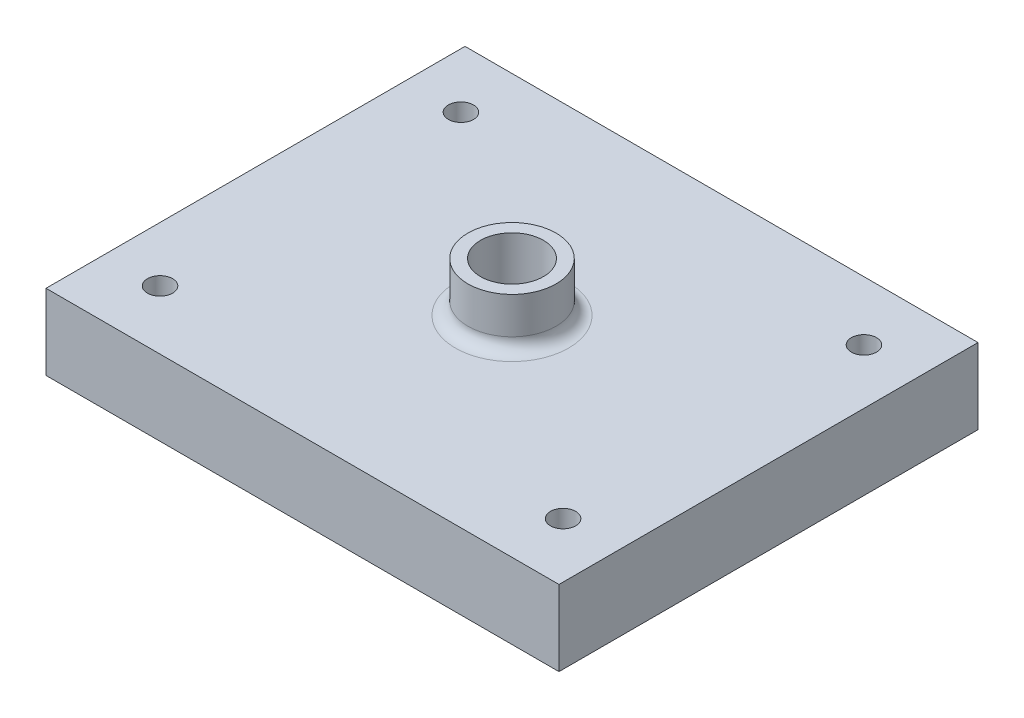
ISO-10303-21;
HEADER;
FILE_DESCRIPTION(('STEP AP214'),'2;1');
FILE_NAME('part.step','',(''),(''),'','','');
FILE_SCHEMA(('AUTOMOTIVE_DESIGN { 1 0 10303 214 1 1 1 1 }'));
ENDSEC;
DATA;
#1=APPLICATION_CONTEXT('core data for automotive mechanical design processes');
#2=APPLICATION_PROTOCOL_DEFINITION('international standard','automotive_design',2000,#1);
#3=PRODUCT_CONTEXT('',#1,'mechanical');
#4=PRODUCT('Part','Part','',(#3));
#5=PRODUCT_RELATED_PRODUCT_CATEGORY('part','',(#4));
#6=PRODUCT_DEFINITION_FORMATION('','',#4);
#7=PRODUCT_DEFINITION_CONTEXT('part definition',#1,'design');
#8=PRODUCT_DEFINITION('design','',#6,#7);
#9=PRODUCT_DEFINITION_SHAPE('','',#8);
#10=(LENGTH_UNIT() NAMED_UNIT(*) SI_UNIT(.MILLI.,.METRE.));
#11=(NAMED_UNIT(*) PLANE_ANGLE_UNIT() SI_UNIT($,.RADIAN.));
#12=(NAMED_UNIT(*) SI_UNIT($,.STERADIAN.) SOLID_ANGLE_UNIT());
#13=UNCERTAINTY_MEASURE_WITH_UNIT(LENGTH_MEASURE(1.E-05),#10,'distance_accuracy_value','');
#14=(GEOMETRIC_REPRESENTATION_CONTEXT(3) GLOBAL_UNCERTAINTY_ASSIGNED_CONTEXT((#13)) GLOBAL_UNIT_ASSIGNED_CONTEXT((#10,
#11,#12)) REPRESENTATION_CONTEXT('',''));
#15=CARTESIAN_POINT('',(0.,0.,0.));
#16=DIRECTION('',(0.,0.,1.));
#17=DIRECTION('',(1.,0.,0.));
#18=AXIS2_PLACEMENT_3D('',#15,#16,#17);
#19=CARTESIAN_POINT('',(6.35000000000018,33.4452211966209,0.));
#20=DIRECTION('',(0.,1.,0.));
#21=DIRECTION('',(0.,0.,1.));
#22=AXIS2_PLACEMENT_3D('',#19,#20,#21);
#23=CYLINDRICAL_SURFACE('',#22,11.1125000000001);
#24=CARTESIAN_POINT('',(6.35000000000018,36.6202211966208,0.));
#25=DIRECTION('',(0.,1.,0.));
#26=DIRECTION('',(1.,0.,0.));
#27=AXIS2_PLACEMENT_3D('',#24,#25,#26);
#28=CIRCLE('',#27,11.1125000000001);
#29=CARTESIAN_POINT('',(17.4625000000003,36.6202211966208,0.));
#30=VERTEX_POINT('',#29);
#31=EDGE_CURVE('E117',#30,#30,#28,.F.);
#32=ORIENTED_EDGE('',*,*,#31,.F.);
#33=EDGE_LOOP('',(#32));
#34=FACE_BOUND('',#33,.T.);
#35=CARTESIAN_POINT('',(6.35000000000018,45.8820294254259,0.));
#36=DIRECTION('',(0.,1.,0.));
#37=DIRECTION('',(0.,0.,1.));
#38=AXIS2_PLACEMENT_3D('',#35,#36,#37);
#39=CIRCLE('',#38,11.1125000000001);
#40=CARTESIAN_POINT('',(6.35000000000018,45.8820294254259,11.1125000000002));
#41=VERTEX_POINT('',#40);
#42=EDGE_CURVE('E19',#41,#41,#39,.T.);
#43=ORIENTED_EDGE('',*,*,#42,.F.);
#44=EDGE_LOOP('',(#43));
#45=FACE_BOUND('',#44,.T.);
#46=ADVANCED_FACE('F16',(#34,#45),#23,.T.);
#47=CARTESIAN_POINT('',(6.35000000000018,36.6202211966208,0.));
#48=DIRECTION('',(0.,1.,0.));
#49=DIRECTION('',(1.,0.,0.));
#50=AXIS2_PLACEMENT_3D('',#47,#48,#49);
#51=TOROIDAL_SURFACE('',#50,14.2875000000001,3.175);
#52=ORIENTED_EDGE('',*,*,#31,.T.);
#53=EDGE_LOOP('',(#52));
#54=FACE_BOUND('',#53,.T.);
#55=CARTESIAN_POINT('',(6.35000000000018,33.4452211966208,0.));
#56=DIRECTION('',(0.,1.,0.));
#57=DIRECTION('',(1.,0.,0.));
#58=AXIS2_PLACEMENT_3D('',#55,#56,#57);
#59=CIRCLE('',#58,14.2875000000001);
#60=CARTESIAN_POINT('',(20.6375000000003,33.4452211966208,0.));
#61=VERTEX_POINT('',#60);
#62=EDGE_CURVE('E88',#61,#61,#59,.F.);
#63=ORIENTED_EDGE('',*,*,#62,.F.);
#64=EDGE_LOOP('',(#63));
#65=FACE_BOUND('',#64,.T.);
#66=ADVANCED_FACE('F108',(#54,#65),#51,.F.);
#67=CARTESIAN_POINT('',(6.35000000000018,45.8820294254259,0.));
#68=DIRECTION('',(0.,1.,0.));
#69=DIRECTION('',(0.,0.,1.));
#70=AXIS2_PLACEMENT_3D('',#67,#68,#69);
#71=PLANE('',#70);
#72=ORIENTED_EDGE('',*,*,#42,.T.);
#73=EDGE_LOOP('',(#72));
#74=FACE_BOUND('',#73,.T.);
#75=CARTESIAN_POINT('',(6.34999999999999,45.8820294254258,0.));
#76=DIRECTION('',(0.,1.,0.));
#77=DIRECTION('',(0.,0.,1.));
#78=AXIS2_PLACEMENT_3D('',#75,#76,#77);
#79=CIRCLE('',#78,7.9375);
#80=CARTESIAN_POINT('',(6.34999999999999,45.8820294254258,7.93750000000007));
#81=VERTEX_POINT('',#80);
#82=EDGE_CURVE('E75',#81,#81,#79,.F.);
#83=ORIENTED_EDGE('',*,*,#82,.T.);
#84=EDGE_LOOP('',(#83));
#85=FACE_BOUND('',#84,.T.);
#86=ADVANCED_FACE('F105',(#74,#85),#71,.T.);
#87=CARTESIAN_POINT('',(6.35000000000009,33.4452211966208,0.));
#88=DIRECTION('',(0.,1.,0.));
#89=DIRECTION('',(0.,0.,1.));
#90=AXIS2_PLACEMENT_3D('',#87,#88,#89);
#91=PLANE('',#90);
#92=ORIENTED_EDGE('',*,*,#62,.T.);
#93=EDGE_LOOP('',(#92));
#94=FACE_BOUND('',#93,.T.);
#95=DIRECTION('',(0.,0.,1.));
#96=VECTOR('',#95,1.);
#97=CARTESIAN_POINT('',(-58.3485005648694,33.4452211966208,52.8472572907137));
#98=LINE('',#97,#96);
#99=CARTESIAN_POINT('',(-58.3485005648694,33.4452211966208,52.8472572907137));
#100=VERTEX_POINT('',#99);
#101=CARTESIAN_POINT('',(-58.3485005648694,33.4452211966208,-52.8472572907137));
#102=VERTEX_POINT('',#101);
#103=EDGE_CURVE('E66',#100,#102,#98,.F.);
#104=ORIENTED_EDGE('',*,*,#103,.F.);
#105=DIRECTION('',(1.,0.,0.));
#106=VECTOR('',#105,1.);
#107=CARTESIAN_POINT('',(71.0485005648693,33.4452211966208,52.8472572907137));
#108=LINE('',#107,#106);
#109=CARTESIAN_POINT('',(71.0485005648693,33.4452211966208,52.8472572907137));
#110=VERTEX_POINT('',#109);
#111=EDGE_CURVE('E57',#110,#100,#108,.F.);
#112=ORIENTED_EDGE('',*,*,#111,.F.);
#113=DIRECTION('',(0.,0.,-1.));
#114=VECTOR('',#113,1.);
#115=CARTESIAN_POINT('',(71.0485005648693,33.4452211966209,-52.8472572907137));
#116=LINE('',#115,#114);
#117=CARTESIAN_POINT('',(71.0485005648693,33.4452211966209,-52.8472572907137));
#118=VERTEX_POINT('',#117);
#119=EDGE_CURVE('E52',#118,#110,#116,.F.);
#120=ORIENTED_EDGE('',*,*,#119,.F.);
#121=DIRECTION('',(1.,0.,0.));
#122=VECTOR('',#121,1.);
#123=CARTESIAN_POINT('',(-58.3485005648694,33.4452211966208,-52.8472572907137));
#124=LINE('',#123,#122);
#125=EDGE_CURVE('E71',#102,#118,#124,.T.);
#126=ORIENTED_EDGE('',*,*,#125,.F.);
#127=EDGE_LOOP('',(#104,#112,#120,#126));
#128=FACE_BOUND('',#127,.T.);
#129=CARTESIAN_POINT('',(57.181182566307,33.4452211966208,37.9490403449471));
#130=DIRECTION('',(0.,1.,0.));
#131=DIRECTION('',(0.,0.,1.));
#132=AXIS2_PLACEMENT_3D('',#129,#130,#131);
#133=CIRCLE('',#132,3.175);
#134=CARTESIAN_POINT('',(57.181182566307,33.4452211966208,41.1240403449471));
#135=VERTEX_POINT('',#134);
#136=EDGE_CURVE('E143',#135,#135,#133,.F.);
#137=ORIENTED_EDGE('',*,*,#136,.T.);
#138=EDGE_LOOP('',(#137));
#139=FACE_BOUND('',#138,.T.);
#140=CARTESIAN_POINT('',(-44.4811825663068,33.4452211966208,-37.9490403449471));
#141=DIRECTION('',(0.,1.,0.));
#142=DIRECTION('',(0.,0.,1.));
#143=AXIS2_PLACEMENT_3D('',#140,#141,#142);
#144=CIRCLE('',#143,3.175);
#145=CARTESIAN_POINT('',(-44.4811825663068,33.4452211966208,-34.7740403449471));
#146=VERTEX_POINT('',#145);
#147=EDGE_CURVE('E146',#146,#146,#144,.F.);
#148=ORIENTED_EDGE('',*,*,#147,.T.);
#149=EDGE_LOOP('',(#148));
#150=FACE_BOUND('',#149,.T.);
#151=CARTESIAN_POINT('',(-44.4811825663068,33.4452211966208,37.9490403449471));
#152=DIRECTION('',(0.,1.,0.));
#153=DIRECTION('',(0.,0.,1.));
#154=AXIS2_PLACEMENT_3D('',#151,#152,#153);
#155=CIRCLE('',#154,3.175);
#156=CARTESIAN_POINT('',(-44.4811825663068,33.4452211966208,41.1240403449471));
#157=VERTEX_POINT('',#156);
#158=EDGE_CURVE('E149',#157,#157,#155,.F.);
#159=ORIENTED_EDGE('',*,*,#158,.T.);
#160=EDGE_LOOP('',(#159));
#161=FACE_BOUND('',#160,.T.);
#162=CARTESIAN_POINT('',(57.181182566307,33.4452211966209,-37.9490403449471));
#163=DIRECTION('',(0.,1.,0.));
#164=DIRECTION('',(0.,0.,1.));
#165=AXIS2_PLACEMENT_3D('',#162,#163,#164);
#166=CIRCLE('',#165,3.175);
#167=CARTESIAN_POINT('',(57.181182566307,33.4452211966209,-34.7740403449471));
#168=VERTEX_POINT('',#167);
#169=EDGE_CURVE('E151',#168,#168,#166,.F.);
#170=ORIENTED_EDGE('',*,*,#169,.T.);
#171=EDGE_LOOP('',(#170));
#172=FACE_BOUND('',#171,.T.);
#173=ADVANCED_FACE('F69',(#94,#128,#139,#150,#161,#172),#91,.T.);
#174=CARTESIAN_POINT('',(57.181182566307,14.3952211966209,-37.9490403449471));
#175=DIRECTION('',(0.,1.,0.));
#176=DIRECTION('',(0.,0.,1.));
#177=AXIS2_PLACEMENT_3D('',#174,#175,#176);
#178=CYLINDRICAL_SURFACE('',#177,3.175);
#179=ORIENTED_EDGE('',*,*,#169,.F.);
#180=EDGE_LOOP('',(#179));
#181=FACE_BOUND('',#180,.T.);
#182=CARTESIAN_POINT('',(57.181182566307,14.3952211966209,-37.9490403449471));
#183=DIRECTION('',(0.,1.,0.));
#184=DIRECTION('',(0.,0.,1.));
#185=AXIS2_PLACEMENT_3D('',#182,#183,#184);
#186=CIRCLE('',#185,3.175);
#187=CARTESIAN_POINT('',(57.181182566307,14.3952211966209,-34.7740403449471));
#188=VERTEX_POINT('',#187);
#189=EDGE_CURVE('E137',#188,#188,#186,.F.);
#190=ORIENTED_EDGE('',*,*,#189,.T.);
#191=EDGE_LOOP('',(#190));
#192=FACE_BOUND('',#191,.T.);
#193=ADVANCED_FACE('F104',(#181,#192),#178,.F.);
#194=CARTESIAN_POINT('',(-44.4811825663068,14.3952211966208,37.9490403449471));
#195=DIRECTION('',(0.,1.,0.));
#196=DIRECTION('',(0.,0.,1.));
#197=AXIS2_PLACEMENT_3D('',#194,#195,#196);
#198=CYLINDRICAL_SURFACE('',#197,3.175);
#199=ORIENTED_EDGE('',*,*,#158,.F.);
#200=EDGE_LOOP('',(#199));
#201=FACE_BOUND('',#200,.T.);
#202=CARTESIAN_POINT('',(-44.4811825663068,14.3952211966208,37.9490403449471));
#203=DIRECTION('',(0.,1.,0.));
#204=DIRECTION('',(0.,0.,1.));
#205=AXIS2_PLACEMENT_3D('',#202,#203,#204);
#206=CIRCLE('',#205,3.175);
#207=CARTESIAN_POINT('',(-44.4811825663068,14.3952211966208,41.124040344947));
#208=VERTEX_POINT('',#207);
#209=EDGE_CURVE('E134',#208,#208,#206,.F.);
#210=ORIENTED_EDGE('',*,*,#209,.T.);
#211=EDGE_LOOP('',(#210));
#212=FACE_BOUND('',#211,.T.);
#213=ADVANCED_FACE('F194',(#201,#212),#198,.F.);
#214=CARTESIAN_POINT('',(-44.4811825663068,14.3952211966208,-37.9490403449471));
#215=DIRECTION('',(0.,1.,0.));
#216=DIRECTION('',(0.,0.,1.));
#217=AXIS2_PLACEMENT_3D('',#214,#215,#216);
#218=CYLINDRICAL_SURFACE('',#217,3.175);
#219=ORIENTED_EDGE('',*,*,#147,.F.);
#220=EDGE_LOOP('',(#219));
#221=FACE_BOUND('',#220,.T.);
#222=CARTESIAN_POINT('',(-44.4811825663068,14.3952211966208,-37.9490403449471));
#223=DIRECTION('',(0.,1.,0.));
#224=DIRECTION('',(0.,0.,1.));
#225=AXIS2_PLACEMENT_3D('',#222,#223,#224);
#226=CIRCLE('',#225,3.175);
#227=CARTESIAN_POINT('',(-44.4811825663068,14.3952211966208,-34.7740403449471));
#228=VERTEX_POINT('',#227);
#229=EDGE_CURVE('E131',#228,#228,#226,.F.);
#230=ORIENTED_EDGE('',*,*,#229,.T.);
#231=EDGE_LOOP('',(#230));
#232=FACE_BOUND('',#231,.T.);
#233=ADVANCED_FACE('F191',(#221,#232),#218,.F.);
#234=CARTESIAN_POINT('',(57.181182566307,14.3952211966208,37.9490403449471));
#235=DIRECTION('',(0.,1.,0.));
#236=DIRECTION('',(0.,0.,1.));
#237=AXIS2_PLACEMENT_3D('',#234,#235,#236);
#238=CYLINDRICAL_SURFACE('',#237,3.175);
#239=ORIENTED_EDGE('',*,*,#136,.F.);
#240=EDGE_LOOP('',(#239));
#241=FACE_BOUND('',#240,.T.);
#242=CARTESIAN_POINT('',(57.181182566307,14.3952211966208,37.9490403449471));
#243=DIRECTION('',(0.,1.,0.));
#244=DIRECTION('',(0.,0.,1.));
#245=AXIS2_PLACEMENT_3D('',#242,#243,#244);
#246=CIRCLE('',#245,3.175);
#247=CARTESIAN_POINT('',(57.181182566307,14.3952211966208,41.124040344947));
#248=VERTEX_POINT('',#247);
#249=EDGE_CURVE('E128',#248,#248,#246,.F.);
#250=ORIENTED_EDGE('',*,*,#249,.T.);
#251=EDGE_LOOP('',(#250));
#252=FACE_BOUND('',#251,.T.);
#253=ADVANCED_FACE('F187',(#241,#252),#238,.F.);
#254=CARTESIAN_POINT('',(6.35,11.2202211966208,0.));
#255=DIRECTION('',(0.,1.,0.));
#256=DIRECTION('',(0.,0.,1.));
#257=AXIS2_PLACEMENT_3D('',#254,#255,#256);
#258=CYLINDRICAL_SURFACE('',#257,7.9375);
#259=CARTESIAN_POINT('',(6.35,14.3952211966208,0.));
#260=DIRECTION('',(0.,1.,0.));
#261=DIRECTION('',(0.,0.,1.));
#262=AXIS2_PLACEMENT_3D('',#259,#260,#261);
#263=CIRCLE('',#262,7.9375);
#264=CARTESIAN_POINT('',(6.35,14.3952211966208,7.93750000000005));
#265=VERTEX_POINT('',#264);
#266=EDGE_CURVE('E125',#265,#265,#263,.F.);
#267=ORIENTED_EDGE('',*,*,#266,.T.);
#268=EDGE_LOOP('',(#267));
#269=FACE_BOUND('',#268,.T.);
#270=ORIENTED_EDGE('',*,*,#82,.F.);
#271=EDGE_LOOP('',(#270));
#272=FACE_BOUND('',#271,.T.);
#273=ADVANCED_FACE('F184',(#269,#272),#258,.F.);
#274=CARTESIAN_POINT('',(-58.3485005648694,14.3952211966208,52.8472572907137));
#275=DIRECTION('',(-1.,0.,0.));
#276=DIRECTION('',(0.,-1.,0.));
#277=AXIS2_PLACEMENT_3D('',#274,#275,#276);
#278=PLANE('',#277);
#279=DIRECTION('',(0.,0.,1.));
#280=VECTOR('',#279,1.);
#281=CARTESIAN_POINT('',(-58.3485005648694,14.3952211966208,0.));
#282=LINE('',#281,#280);
#283=CARTESIAN_POINT('',(-58.3485005648694,14.3952211966209,-52.8472572907137));
#284=VERTEX_POINT('',#283);
#285=CARTESIAN_POINT('',(-58.3485005648694,14.3952211966208,52.8472572907137));
#286=VERTEX_POINT('',#285);
#287=EDGE_CURVE('E79',#284,#286,#282,.T.);
#288=ORIENTED_EDGE('',*,*,#287,.T.);
#289=DIRECTION('',(0.,-1.,0.));
#290=VECTOR('',#289,1.);
#291=CARTESIAN_POINT('',(-58.3485005648694,14.3952211966208,52.8472572907137));
#292=LINE('',#291,#290);
#293=EDGE_CURVE('E62',#100,#286,#292,.T.);
#294=ORIENTED_EDGE('',*,*,#293,.F.);
#295=ORIENTED_EDGE('',*,*,#103,.T.);
#296=DIRECTION('',(0.,1.,0.));
#297=VECTOR('',#296,1.);
#298=CARTESIAN_POINT('',(-58.3485005648694,14.3952211966208,-52.8472572907137));
#299=LINE('',#298,#297);
#300=EDGE_CURVE('E140',#284,#102,#299,.T.);
#301=ORIENTED_EDGE('',*,*,#300,.F.);
#302=EDGE_LOOP('',(#288,#294,#295,#301));
#303=FACE_BOUND('',#302,.T.);
#304=ADVANCED_FACE('F78',(#303),#278,.T.);
#305=CARTESIAN_POINT('',(71.0485005648693,14.3952211966208,52.8472572907137));
#306=DIRECTION('',(0.,0.,1.));
#307=DIRECTION('',(0.,-1.,0.));
#308=AXIS2_PLACEMENT_3D('',#305,#306,#307);
#309=PLANE('',#308);
#310=DIRECTION('',(1.,0.,0.));
#311=VECTOR('',#310,1.);
#312=CARTESIAN_POINT('',(6.35000000000009,14.3952211966208,52.8472572907137));
#313=LINE('',#312,#311);
#314=CARTESIAN_POINT('',(71.0485005648693,14.3952211966208,52.8472572907137));
#315=VERTEX_POINT('',#314);
#316=EDGE_CURVE('E278',#286,#315,#313,.T.);
#317=ORIENTED_EDGE('',*,*,#316,.T.);
#318=DIRECTION('',(0.,1.,0.));
#319=VECTOR('',#318,1.);
#320=CARTESIAN_POINT('',(71.0485005648693,14.3952211966209,52.8472572907138));
#321=LINE('',#320,#319);
#322=EDGE_CURVE('E64',#110,#315,#321,.F.);
#323=ORIENTED_EDGE('',*,*,#322,.F.);
#324=ORIENTED_EDGE('',*,*,#111,.T.);
#325=ORIENTED_EDGE('',*,*,#293,.T.);
#326=EDGE_LOOP('',(#317,#323,#324,#325));
#327=FACE_BOUND('',#326,.T.);
#328=ADVANCED_FACE('F60',(#327),#309,.T.);
#329=CARTESIAN_POINT('',(71.0485005648693,14.3952211966209,-52.8472572907137));
#330=DIRECTION('',(1.,0.,0.));
#331=DIRECTION('',(0.,0.,-1.));
#332=AXIS2_PLACEMENT_3D('',#329,#330,#331);
#333=PLANE('',#332);
#334=DIRECTION('',(0.,0.,1.));
#335=VECTOR('',#334,1.);
#336=CARTESIAN_POINT('',(71.0485005648693,14.3952211966208,0.));
#337=LINE('',#336,#335);
#338=CARTESIAN_POINT('',(71.0485005648693,14.3952211966208,-52.8472572907137));
#339=VERTEX_POINT('',#338);
#340=EDGE_CURVE('E25',#315,#339,#337,.F.);
#341=ORIENTED_EDGE('',*,*,#340,.T.);
#342=DIRECTION('',(0.,1.,0.));
#343=VECTOR('',#342,1.);
#344=CARTESIAN_POINT('',(71.0485005648693,14.3952211966208,-52.8472572907137));
#345=LINE('',#344,#343);
#346=EDGE_CURVE('E33',#118,#339,#345,.F.);
#347=ORIENTED_EDGE('',*,*,#346,.F.);
#348=ORIENTED_EDGE('',*,*,#119,.T.);
#349=ORIENTED_EDGE('',*,*,#322,.T.);
#350=EDGE_LOOP('',(#341,#347,#348,#349));
#351=FACE_BOUND('',#350,.T.);
#352=ADVANCED_FACE('F173',(#351),#333,.T.);
#353=CARTESIAN_POINT('',(-58.3485005648694,14.3952211966208,-52.8472572907137));
#354=DIRECTION('',(0.,0.,-1.));
#355=DIRECTION('',(0.,1.,0.));
#356=AXIS2_PLACEMENT_3D('',#353,#354,#355);
#357=PLANE('',#356);
#358=DIRECTION('',(1.,0.,0.));
#359=VECTOR('',#358,1.);
#360=CARTESIAN_POINT('',(6.35000000000009,14.3952211966209,-52.8472572907137));
#361=LINE('',#360,#359);
#362=EDGE_CURVE('E10',#339,#284,#361,.F.);
#363=ORIENTED_EDGE('',*,*,#362,.T.);
#364=ORIENTED_EDGE('',*,*,#300,.T.);
#365=ORIENTED_EDGE('',*,*,#125,.T.);
#366=ORIENTED_EDGE('',*,*,#346,.T.);
#367=EDGE_LOOP('',(#363,#364,#365,#366));
#368=FACE_BOUND('',#367,.T.);
#369=ADVANCED_FACE('F167',(#368),#357,.T.);
#370=CARTESIAN_POINT('',(6.35000000000009,14.3952211966208,0.));
#371=DIRECTION('',(0.,1.,0.));
#372=DIRECTION('',(0.,0.,1.));
#373=AXIS2_PLACEMENT_3D('',#370,#371,#372);
#374=PLANE('',#373);
#375=ORIENTED_EDGE('',*,*,#340,.F.);
#376=ORIENTED_EDGE('',*,*,#316,.F.);
#377=ORIENTED_EDGE('',*,*,#287,.F.);
#378=ORIENTED_EDGE('',*,*,#362,.F.);
#379=EDGE_LOOP('',(#375,#376,#377,#378));
#380=FACE_BOUND('',#379,.T.);
#381=ORIENTED_EDGE('',*,*,#266,.F.);
#382=EDGE_LOOP('',(#381));
#383=FACE_BOUND('',#382,.T.);
#384=ORIENTED_EDGE('',*,*,#249,.F.);
#385=EDGE_LOOP('',(#384));
#386=FACE_BOUND('',#385,.T.);
#387=ORIENTED_EDGE('',*,*,#229,.F.);
#388=EDGE_LOOP('',(#387));
#389=FACE_BOUND('',#388,.T.);
#390=ORIENTED_EDGE('',*,*,#209,.F.);
#391=EDGE_LOOP('',(#390));
#392=FACE_BOUND('',#391,.T.);
#393=ORIENTED_EDGE('',*,*,#189,.F.);
#394=EDGE_LOOP('',(#393));
#395=FACE_BOUND('',#394,.T.);
#396=ADVANCED_FACE('F165',(#380,#383,#386,#389,#392,#395),#374,.F.);
#397=CLOSED_SHELL('',(#46,#66,#86,#173,#193,#213,#233,#253,#273,#304,#328,#352,#369,#396));
#398=MANIFOLD_SOLID_BREP('B1',#397);
#399=ADVANCED_BREP_SHAPE_REPRESENTATION('',(#18,#398),#14);
#400=SHAPE_DEFINITION_REPRESENTATION(#9,#399);
ENDSEC;
END-ISO-10303-21;
